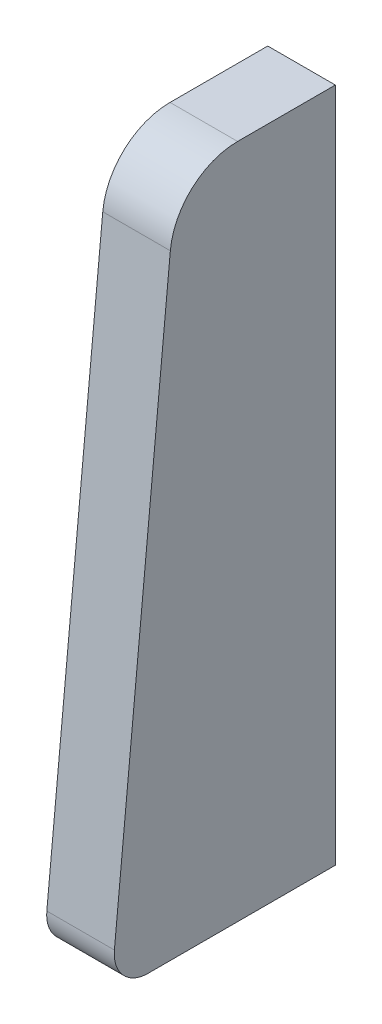
ISO-10303-21;
HEADER;
FILE_DESCRIPTION(('STEP AP214'),'2;1');
FILE_NAME('part.step','',(''),(''),'','','');
FILE_SCHEMA(('AUTOMOTIVE_DESIGN { 1 0 10303 214 1 1 1 1 }'));
ENDSEC;
DATA;
#1=APPLICATION_CONTEXT('core data for automotive mechanical design processes');
#2=APPLICATION_PROTOCOL_DEFINITION('international standard','automotive_design',2000,#1);
#3=PRODUCT_CONTEXT('',#1,'mechanical');
#4=PRODUCT('Part','Part','',(#3));
#5=PRODUCT_RELATED_PRODUCT_CATEGORY('part','',(#4));
#6=PRODUCT_DEFINITION_FORMATION('','',#4);
#7=PRODUCT_DEFINITION_CONTEXT('part definition',#1,'design');
#8=PRODUCT_DEFINITION('design','',#6,#7);
#9=PRODUCT_DEFINITION_SHAPE('','',#8);
#10=(LENGTH_UNIT() NAMED_UNIT(*) SI_UNIT(.MILLI.,.METRE.));
#11=(NAMED_UNIT(*) PLANE_ANGLE_UNIT() SI_UNIT($,.RADIAN.));
#12=(NAMED_UNIT(*) SI_UNIT($,.STERADIAN.) SOLID_ANGLE_UNIT());
#13=UNCERTAINTY_MEASURE_WITH_UNIT(LENGTH_MEASURE(1.E-05),#10,'distance_accuracy_value','');
#14=(GEOMETRIC_REPRESENTATION_CONTEXT(3) GLOBAL_UNCERTAINTY_ASSIGNED_CONTEXT((#13)) GLOBAL_UNIT_ASSIGNED_CONTEXT((#10,
#11,#12)) REPRESENTATION_CONTEXT('',''));
#15=CARTESIAN_POINT('',(0.,0.,0.));
#16=DIRECTION('',(0.,0.,1.));
#17=DIRECTION('',(1.,0.,0.));
#18=AXIS2_PLACEMENT_3D('',#15,#16,#17);
#19=CARTESIAN_POINT('',(6.35,1.23165366794353E-13,35.2018146782135));
#20=DIRECTION('',(0.,1.,0.));
#21=DIRECTION('',(0.,0.,1.));
#22=AXIS2_PLACEMENT_3D('',#19,#20,#21);
#23=PLANE('',#22);
#24=DIRECTION('',(0.,0.,-1.));
#25=VECTOR('',#24,1.);
#26=CARTESIAN_POINT('',(-6.35,1.23165366794353E-13,35.2018146782135));
#27=LINE('',#26,#25);
#28=CARTESIAN_POINT('',(-6.35,1.20563281580388E-13,35.2018146782135));
#29=VERTEX_POINT('',#28);
#30=CARTESIAN_POINT('',(-6.35,0.,0.));
#31=VERTEX_POINT('',#30);
#32=EDGE_CURVE('E135',#29,#31,#27,.T.);
#33=ORIENTED_EDGE('',*,*,#32,.T.);
#34=DIRECTION('',(-1.,0.,0.));
#35=VECTOR('',#34,1.);
#36=CARTESIAN_POINT('',(6.35,0.,0.));
#37=LINE('',#36,#35);
#38=CARTESIAN_POINT('',(6.35,0.,0.));
#39=VERTEX_POINT('',#38);
#40=EDGE_CURVE('E171',#39,#31,#37,.T.);
#41=ORIENTED_EDGE('',*,*,#40,.F.);
#42=DIRECTION('',(0.,0.,-1.));
#43=VECTOR('',#42,1.);
#44=CARTESIAN_POINT('',(6.35,1.23165366794353E-13,35.2018146782135));
#45=LINE('',#44,#43);
#46=CARTESIAN_POINT('',(6.35,1.20563281580388E-13,35.2018146782135));
#47=VERTEX_POINT('',#46);
#48=EDGE_CURVE('E136',#47,#39,#45,.T.);
#49=ORIENTED_EDGE('',*,*,#48,.F.);
#50=DIRECTION('',(-1.,0.,0.));
#51=VECTOR('',#50,1.);
#52=CARTESIAN_POINT('',(6.35,1.20563281580388E-13,35.2018146782135));
#53=LINE('',#52,#51);
#54=EDGE_CURVE('E150',#47,#29,#53,.T.);
#55=ORIENTED_EDGE('',*,*,#54,.T.);
#56=EDGE_LOOP('',(#33,#41,#49,#55));
#57=FACE_BOUND('',#56,.T.);
#58=ADVANCED_FACE('F55',(#57),#23,.F.);
#59=CARTESIAN_POINT('',(6.35,0.,0.));
#60=DIRECTION('',(0.,0.,1.));
#61=DIRECTION('',(1.,0.,0.));
#62=AXIS2_PLACEMENT_3D('',#59,#60,#61);
#63=PLANE('',#62);
#64=CARTESIAN_POINT('',(0.,12.7,0.));
#65=DIRECTION('',(0.,0.,-1.));
#66=DIRECTION('',(-1.,0.,0.));
#67=AXIS2_PLACEMENT_3D('',#64,#65,#66);
#68=CIRCLE('',#67,1.89864999999999);
#69=CARTESIAN_POINT('',(-1.89864999999999,12.7,0.));
#70=VERTEX_POINT('',#69);
#71=EDGE_CURVE('E125',#70,#70,#68,.T.);
#72=ORIENTED_EDGE('',*,*,#71,.F.);
#73=EDGE_LOOP('',(#72));
#74=FACE_BOUND('',#73,.T.);
#75=CARTESIAN_POINT('',(0.,69.85,0.));
#76=DIRECTION('',(0.,0.,-1.));
#77=DIRECTION('',(-1.,0.,0.));
#78=AXIS2_PLACEMENT_3D('',#75,#76,#77);
#79=CIRCLE('',#78,1.89864999999999);
#80=CARTESIAN_POINT('',(-1.89864999999999,69.85,0.));
#81=VERTEX_POINT('',#80);
#82=EDGE_CURVE('E124',#81,#81,#79,.T.);
#83=ORIENTED_EDGE('',*,*,#82,.F.);
#84=EDGE_LOOP('',(#83));
#85=FACE_BOUND('',#84,.T.);
#86=DIRECTION('',(0.,1.,0.));
#87=VECTOR('',#86,1.);
#88=CARTESIAN_POINT('',(-6.35,0.,0.));
#89=LINE('',#88,#87);
#90=CARTESIAN_POINT('',(-6.35,127.,0.));
#91=VERTEX_POINT('',#90);
#92=EDGE_CURVE('E154',#31,#91,#89,.T.);
#93=ORIENTED_EDGE('',*,*,#92,.T.);
#94=DIRECTION('',(-1.,0.,0.));
#95=VECTOR('',#94,1.);
#96=CARTESIAN_POINT('',(6.35,127.,0.));
#97=LINE('',#96,#95);
#98=CARTESIAN_POINT('',(6.35,127.,0.));
#99=VERTEX_POINT('',#98);
#100=EDGE_CURVE('E168',#99,#91,#97,.T.);
#101=ORIENTED_EDGE('',*,*,#100,.F.);
#102=DIRECTION('',(0.,1.,0.));
#103=VECTOR('',#102,1.);
#104=CARTESIAN_POINT('',(6.35,0.,0.));
#105=LINE('',#104,#103);
#106=EDGE_CURVE('E140',#39,#99,#105,.T.);
#107=ORIENTED_EDGE('',*,*,#106,.F.);
#108=ORIENTED_EDGE('',*,*,#40,.T.);
#109=EDGE_LOOP('',(#93,#101,#107,#108));
#110=FACE_BOUND('',#109,.T.);
#111=ADVANCED_FACE('F203',(#74,#85,#110),#63,.F.);
#112=CARTESIAN_POINT('',(6.35,127.,0.));
#113=DIRECTION('',(0.,-1.,0.));
#114=DIRECTION('',(0.,0.,-1.));
#115=AXIS2_PLACEMENT_3D('',#112,#113,#114);
#116=PLANE('',#115);
#117=DIRECTION('',(0.,0.,1.));
#118=VECTOR('',#117,1.);
#119=CARTESIAN_POINT('',(-6.35,127.,0.));
#120=LINE('',#119,#118);
#121=CARTESIAN_POINT('',(-6.35,127.,18.3673431354562));
#122=VERTEX_POINT('',#121);
#123=EDGE_CURVE('E156',#91,#122,#120,.T.);
#124=ORIENTED_EDGE('',*,*,#123,.T.);
#125=DIRECTION('',(-1.,0.,0.));
#126=VECTOR('',#125,1.);
#127=CARTESIAN_POINT('',(6.35,127.,18.3673431354562));
#128=LINE('',#127,#126);
#129=CARTESIAN_POINT('',(6.35,127.,18.3673431354562));
#130=VERTEX_POINT('',#129);
#131=EDGE_CURVE('E63',#122,#130,#128,.F.);
#132=ORIENTED_EDGE('',*,*,#131,.T.);
#133=DIRECTION('',(0.,0.,1.));
#134=VECTOR('',#133,1.);
#135=CARTESIAN_POINT('',(6.35,127.,0.));
#136=LINE('',#135,#134);
#137=EDGE_CURVE('E143',#99,#130,#136,.T.);
#138=ORIENTED_EDGE('',*,*,#137,.F.);
#139=ORIENTED_EDGE('',*,*,#100,.T.);
#140=EDGE_LOOP('',(#124,#132,#138,#139));
#141=FACE_BOUND('',#140,.T.);
#142=ADVANCED_FACE('F207',(#141),#116,.F.);
#143=CARTESIAN_POINT('',(6.35,127.,29.896792519901));
#144=DIRECTION('',(0.,-0.0963971521540011,-0.995342950473152));
#145=DIRECTION('',(0.,0.995342950473151,-0.096397152154001));
#146=AXIS2_PLACEMENT_3D('',#143,#144,#145);
#147=PLANE('',#146);
#148=DIRECTION('',(0.,-0.995342950473151,0.096397152154001));
#149=VECTOR('',#148,1.);
#150=CARTESIAN_POINT('',(6.35,127.,29.896792519901));
#151=LINE('',#150,#149);
#152=CARTESIAN_POINT('',(6.35,115.524243832356,31.0081986064652));
#153=VERTEX_POINT('',#152);
#154=CARTESIAN_POINT('',(6.35,6.96212191617803,41.522242413718));
#155=VERTEX_POINT('',#154);
#156=EDGE_CURVE('E145',#153,#155,#151,.T.);
#157=ORIENTED_EDGE('',*,*,#156,.F.);
#158=DIRECTION('',(-1.,0.,0.));
#159=VECTOR('',#158,1.);
#160=CARTESIAN_POINT('',(6.35,115.524243832356,31.0081986064652));
#161=LINE('',#160,#159);
#162=CARTESIAN_POINT('',(-6.35,115.524243832356,31.0081986064652));
#163=VERTEX_POINT('',#162);
#164=EDGE_CURVE('E174',#153,#163,#161,.T.);
#165=ORIENTED_EDGE('',*,*,#164,.T.);
#166=DIRECTION('',(0.,-0.995342950473151,0.096397152154001));
#167=VECTOR('',#166,1.);
#168=CARTESIAN_POINT('',(-6.35,127.,29.896792519901));
#169=LINE('',#168,#167);
#170=CARTESIAN_POINT('',(-6.35,6.96212191617803,41.522242413718));
#171=VERTEX_POINT('',#170);
#172=EDGE_CURVE('E158',#163,#171,#169,.T.);
#173=ORIENTED_EDGE('',*,*,#172,.T.);
#174=DIRECTION('',(-1.,0.,0.));
#175=VECTOR('',#174,1.);
#176=CARTESIAN_POINT('',(6.35,6.96212191617803,41.522242413718));
#177=LINE('',#176,#175);
#178=EDGE_CURVE('E165',#155,#171,#177,.T.);
#179=ORIENTED_EDGE('',*,*,#178,.F.);
#180=EDGE_LOOP('',(#157,#165,#173,#179));
#181=FACE_BOUND('',#180,.T.);
#182=ADVANCED_FACE('F180',(#181),#147,.F.);
#183=CARTESIAN_POINT('',(6.35,6.35000000000012,35.2018146782135));
#184=DIRECTION('',(-1.,0.,0.));
#185=DIRECTION('',(0.,0.,1.));
#186=AXIS2_PLACEMENT_3D('',#183,#184,#185);
#187=CYLINDRICAL_SURFACE('',#186,6.35);
#188=CARTESIAN_POINT('',(-6.35,6.35000000000012,35.2018146782135));
#189=DIRECTION('',(1.,0.,0.));
#190=DIRECTION('',(0.,0.,-1.));
#191=AXIS2_PLACEMENT_3D('',#188,#189,#190);
#192=CIRCLE('',#191,6.35);
#193=EDGE_CURVE('E141',#171,#29,#192,.T.);
#194=ORIENTED_EDGE('',*,*,#193,.T.);
#195=ORIENTED_EDGE('',*,*,#54,.F.);
#196=CARTESIAN_POINT('',(6.35,6.35000000000012,35.2018146782135));
#197=DIRECTION('',(1.,0.,0.));
#198=DIRECTION('',(0.,0.,-1.));
#199=AXIS2_PLACEMENT_3D('',#196,#197,#198);
#200=CIRCLE('',#199,6.35);
#201=EDGE_CURVE('E147',#155,#47,#200,.T.);
#202=ORIENTED_EDGE('',*,*,#201,.F.);
#203=ORIENTED_EDGE('',*,*,#178,.T.);
#204=EDGE_LOOP('',(#194,#195,#202,#203));
#205=FACE_BOUND('',#204,.T.);
#206=ADVANCED_FACE('F189',(#205),#187,.T.);
#207=CARTESIAN_POINT('',(6.35,6.35000000000012,35.2018146782135));
#208=DIRECTION('',(1.,0.,0.));
#209=DIRECTION('',(0.,0.,-1.));
#210=AXIS2_PLACEMENT_3D('',#207,#208,#209);
#211=PLANE('',#210);
#212=ORIENTED_EDGE('',*,*,#137,.T.);
#213=CARTESIAN_POINT('',(6.35,114.3,18.3673431354561));
#214=DIRECTION('',(1.,0.,0.));
#215=DIRECTION('',(0.,0.,-1.));
#216=AXIS2_PLACEMENT_3D('',#213,#214,#215);
#217=CIRCLE('',#216,12.7);
#218=EDGE_CURVE('E13',#130,#153,#217,.T.);
#219=ORIENTED_EDGE('',*,*,#218,.T.);
#220=ORIENTED_EDGE('',*,*,#156,.T.);
#221=ORIENTED_EDGE('',*,*,#201,.T.);
#222=ORIENTED_EDGE('',*,*,#48,.T.);
#223=ORIENTED_EDGE('',*,*,#106,.T.);
#224=EDGE_LOOP('',(#212,#219,#220,#221,#222,#223));
#225=FACE_BOUND('',#224,.T.);
#226=ADVANCED_FACE('F195',(#225),#211,.T.);
#227=CARTESIAN_POINT('',(-6.35,6.35000000000012,35.2018146782135));
#228=DIRECTION('',(1.,0.,0.));
#229=DIRECTION('',(0.,0.,-1.));
#230=AXIS2_PLACEMENT_3D('',#227,#228,#229);
#231=PLANE('',#230);
#232=ORIENTED_EDGE('',*,*,#172,.F.);
#233=CARTESIAN_POINT('',(-6.35,114.3,18.3673431354561));
#234=DIRECTION('',(1.,0.,0.));
#235=DIRECTION('',(0.,0.,-1.));
#236=AXIS2_PLACEMENT_3D('',#233,#234,#235);
#237=CIRCLE('',#236,12.7);
#238=EDGE_CURVE('E77',#163,#122,#237,.F.);
#239=ORIENTED_EDGE('',*,*,#238,.T.);
#240=ORIENTED_EDGE('',*,*,#123,.F.);
#241=ORIENTED_EDGE('',*,*,#92,.F.);
#242=ORIENTED_EDGE('',*,*,#32,.F.);
#243=ORIENTED_EDGE('',*,*,#193,.F.);
#244=EDGE_LOOP('',(#232,#239,#240,#241,#242,#243));
#245=FACE_BOUND('',#244,.T.);
#246=ADVANCED_FACE('F185',(#245),#231,.F.);
#247=CARTESIAN_POINT('',(0.,69.85,14.9606));
#248=DIRECTION('',(0.,0.,-1.));
#249=DIRECTION('',(-1.,0.,0.));
#250=AXIS2_PLACEMENT_3D('',#247,#248,#249);
#251=CONICAL_SURFACE('',#250,1.89865,1.02974425867665);
#252=CARTESIAN_POINT('',(0.,69.85,16.1014240143167));
#253=VERTEX_POINT('',#252);
#254=VERTEX_LOOP('',#253);
#255=FACE_BOUND('',#254,.T.);
#256=CARTESIAN_POINT('',(0.,69.85,14.9606));
#257=DIRECTION('',(0.,0.,-1.));
#258=DIRECTION('',(-1.,0.,0.));
#259=AXIS2_PLACEMENT_3D('',#256,#257,#258);
#260=CIRCLE('',#259,1.89865);
#261=CARTESIAN_POINT('',(-1.89865,69.85,14.9606));
#262=VERTEX_POINT('',#261);
#263=EDGE_CURVE('E128',#262,#262,#260,.T.);
#264=ORIENTED_EDGE('',*,*,#263,.T.);
#265=EDGE_LOOP('',(#264));
#266=FACE_BOUND('',#265,.T.);
#267=ADVANCED_FACE('F219',(#255,#266),#251,.F.);
#268=CARTESIAN_POINT('',(0.,69.85,0.));
#269=DIRECTION('',(0.,0.,-1.));
#270=DIRECTION('',(-1.,0.,0.));
#271=AXIS2_PLACEMENT_3D('',#268,#269,#270);
#272=CYLINDRICAL_SURFACE('',#271,1.89864999999999);
#273=ORIENTED_EDGE('',*,*,#263,.F.);
#274=EDGE_LOOP('',(#273));
#275=FACE_BOUND('',#274,.T.);
#276=ORIENTED_EDGE('',*,*,#82,.T.);
#277=EDGE_LOOP('',(#276));
#278=FACE_BOUND('',#277,.T.);
#279=ADVANCED_FACE('F118',(#275,#278),#272,.F.);
#280=CARTESIAN_POINT('',(0.,12.7,14.9606));
#281=DIRECTION('',(0.,0.,-1.));
#282=DIRECTION('',(-1.,0.,0.));
#283=AXIS2_PLACEMENT_3D('',#280,#281,#282);
#284=CONICAL_SURFACE('',#283,1.89865,1.02974425867665);
#285=CARTESIAN_POINT('',(0.,12.7,16.1014240143167));
#286=VERTEX_POINT('',#285);
#287=VERTEX_LOOP('',#286);
#288=FACE_BOUND('',#287,.T.);
#289=CARTESIAN_POINT('',(0.,12.7,14.9606));
#290=DIRECTION('',(0.,0.,-1.));
#291=DIRECTION('',(-1.,0.,0.));
#292=AXIS2_PLACEMENT_3D('',#289,#290,#291);
#293=CIRCLE('',#292,1.89865);
#294=CARTESIAN_POINT('',(-1.89865,12.7,14.9606));
#295=VERTEX_POINT('',#294);
#296=EDGE_CURVE('E122',#295,#295,#293,.T.);
#297=ORIENTED_EDGE('',*,*,#296,.T.);
#298=EDGE_LOOP('',(#297));
#299=FACE_BOUND('',#298,.T.);
#300=ADVANCED_FACE('F114',(#288,#299),#284,.F.);
#301=CARTESIAN_POINT('',(0.,12.7,0.));
#302=DIRECTION('',(0.,0.,-1.));
#303=DIRECTION('',(-1.,0.,0.));
#304=AXIS2_PLACEMENT_3D('',#301,#302,#303);
#305=CYLINDRICAL_SURFACE('',#304,1.89864999999999);
#306=ORIENTED_EDGE('',*,*,#296,.F.);
#307=EDGE_LOOP('',(#306));
#308=FACE_BOUND('',#307,.T.);
#309=ORIENTED_EDGE('',*,*,#71,.T.);
#310=EDGE_LOOP('',(#309));
#311=FACE_BOUND('',#310,.T.);
#312=ADVANCED_FACE('F117',(#308,#311),#305,.F.);
#313=CARTESIAN_POINT('',(6.35,114.3,18.3673431354561));
#314=DIRECTION('',(-1.,0.,0.));
#315=DIRECTION('',(0.,0.,1.));
#316=AXIS2_PLACEMENT_3D('',#313,#314,#315);
#317=CYLINDRICAL_SURFACE('',#316,12.7);
#318=ORIENTED_EDGE('',*,*,#218,.F.);
#319=ORIENTED_EDGE('',*,*,#131,.F.);
#320=ORIENTED_EDGE('',*,*,#238,.F.);
#321=ORIENTED_EDGE('',*,*,#164,.F.);
#322=EDGE_LOOP('',(#318,#319,#320,#321));
#323=FACE_BOUND('',#322,.T.);
#324=ADVANCED_FACE('F57',(#323),#317,.T.);
#325=CLOSED_SHELL('',(#58,#111,#142,#182,#206,#226,#246,#267,#279,#300,#312,#324));
#326=MANIFOLD_SOLID_BREP('B2',#325);
#327=ADVANCED_BREP_SHAPE_REPRESENTATION('',(#18,#326),#14);
#328=SHAPE_DEFINITION_REPRESENTATION(#9,#327);
ENDSEC;
END-ISO-10303-21;
